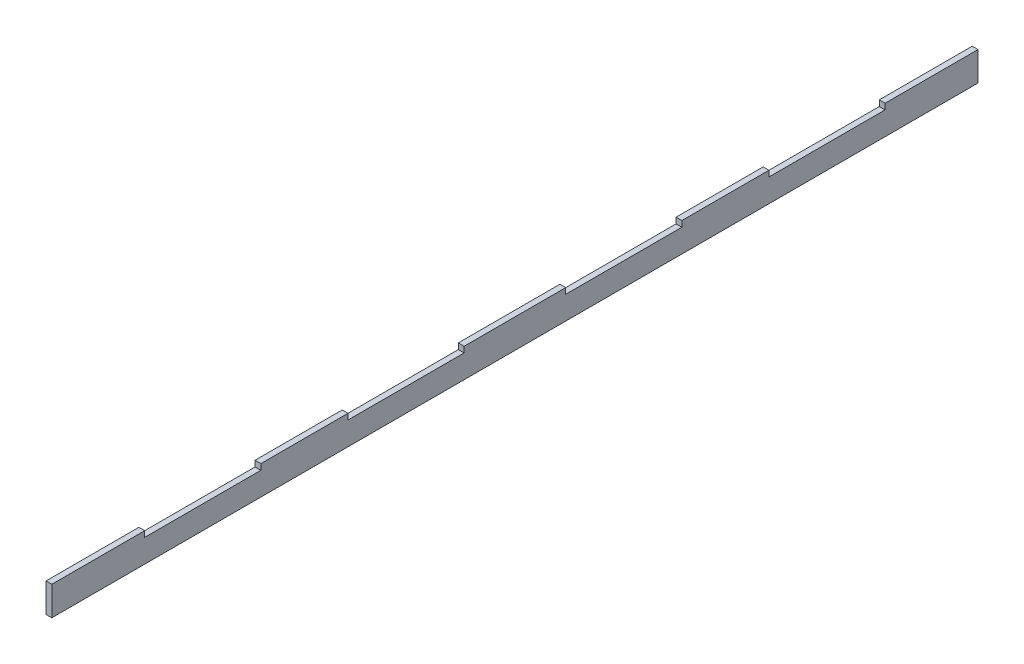
ISO-10303-21;
HEADER;
FILE_DESCRIPTION(('STEP AP214'),'2;1');
FILE_NAME('part.step','',(''),(''),'','','');
FILE_SCHEMA(('AUTOMOTIVE_DESIGN { 1 0 10303 214 1 1 1 1 }'));
ENDSEC;
DATA;
#1=APPLICATION_CONTEXT('core data for automotive mechanical design processes');
#2=APPLICATION_PROTOCOL_DEFINITION('international standard','automotive_design',2000,#1);
#3=PRODUCT_CONTEXT('',#1,'mechanical');
#4=PRODUCT('Part','Part','',(#3));
#5=PRODUCT_RELATED_PRODUCT_CATEGORY('part','',(#4));
#6=PRODUCT_DEFINITION_FORMATION('','',#4);
#7=PRODUCT_DEFINITION_CONTEXT('part definition',#1,'design');
#8=PRODUCT_DEFINITION('design','',#6,#7);
#9=PRODUCT_DEFINITION_SHAPE('','',#8);
#10=(LENGTH_UNIT() NAMED_UNIT(*) SI_UNIT(.MILLI.,.METRE.));
#11=(NAMED_UNIT(*) PLANE_ANGLE_UNIT() SI_UNIT($,.RADIAN.));
#12=(NAMED_UNIT(*) SI_UNIT($,.STERADIAN.) SOLID_ANGLE_UNIT());
#13=UNCERTAINTY_MEASURE_WITH_UNIT(LENGTH_MEASURE(1.E-05),#10,'distance_accuracy_value','');
#14=(GEOMETRIC_REPRESENTATION_CONTEXT(3) GLOBAL_UNCERTAINTY_ASSIGNED_CONTEXT((#13)) GLOBAL_UNIT_ASSIGNED_CONTEXT((#10,
#11,#12)) REPRESENTATION_CONTEXT('',''));
#15=CARTESIAN_POINT('',(0.,0.,0.));
#16=DIRECTION('',(0.,0.,1.));
#17=DIRECTION('',(1.,0.,0.));
#18=AXIS2_PLACEMENT_3D('',#15,#16,#17);
#19=CARTESIAN_POINT('',(2.,5.,159.5));
#20=DIRECTION('',(0.,-1.,0.));
#21=DIRECTION('',(0.,0.,-1.));
#22=AXIS2_PLACEMENT_3D('',#19,#20,#21);
#23=PLANE('',#22);
#24=DIRECTION('',(0.,0.,1.));
#25=VECTOR('',#24,1.);
#26=CARTESIAN_POINT('',(2.,5.,159.5));
#27=LINE('',#26,#25);
#28=CARTESIAN_POINT('',(2.,5.,127.5));
#29=VERTEX_POINT('',#28);
#30=CARTESIAN_POINT('',(2.,5.,159.5));
#31=VERTEX_POINT('',#30);
#32=EDGE_CURVE('E295',#29,#31,#27,.T.);
#33=ORIENTED_EDGE('',*,*,#32,.F.);
#34=DIRECTION('',(1.,0.,0.));
#35=VECTOR('',#34,1.);
#36=CARTESIAN_POINT('',(0.,5.,127.5));
#37=LINE('',#36,#35);
#38=CARTESIAN_POINT('',(0.,5.,127.5));
#39=VERTEX_POINT('',#38);
#40=EDGE_CURVE('E198',#39,#29,#37,.T.);
#41=ORIENTED_EDGE('',*,*,#40,.F.);
#42=DIRECTION('',(0.,0.,1.));
#43=VECTOR('',#42,1.);
#44=CARTESIAN_POINT('',(0.,5.,159.5));
#45=LINE('',#44,#43);
#46=CARTESIAN_POINT('',(0.,5.,159.5));
#47=VERTEX_POINT('',#46);
#48=EDGE_CURVE('E191',#39,#47,#45,.T.);
#49=ORIENTED_EDGE('',*,*,#48,.T.);
#50=DIRECTION('',(-1.,0.,0.));
#51=VECTOR('',#50,1.);
#52=CARTESIAN_POINT('',(2.,5.,159.5));
#53=LINE('',#52,#51);
#54=EDGE_CURVE('E41',#31,#47,#53,.T.);
#55=ORIENTED_EDGE('',*,*,#54,.F.);
#56=EDGE_LOOP('',(#33,#41,#49,#55));
#57=FACE_BOUND('',#56,.T.);
#58=ADVANCED_FACE('F33',(#57),#23,.F.);
#59=CARTESIAN_POINT('',(0.,5.,57.4999999999999));
#60=VERTEX_POINT('',#59);
#61=CARTESIAN_POINT('',(0.,5.,87.4999999999999));
#62=VERTEX_POINT('',#61);
#63=EDGE_CURVE('E375',#60,#62,#45,.T.);
#64=ORIENTED_EDGE('',*,*,#63,.T.);
#65=DIRECTION('',(1.,0.,0.));
#66=VECTOR('',#65,1.);
#67=CARTESIAN_POINT('',(0.,5.,87.4999999999999));
#68=LINE('',#67,#66);
#69=CARTESIAN_POINT('',(2.,5.,87.4999999999999));
#70=VERTEX_POINT('',#69);
#71=EDGE_CURVE('E201',#62,#70,#68,.T.);
#72=ORIENTED_EDGE('',*,*,#71,.T.);
#73=CARTESIAN_POINT('',(2.,5.,57.4999999999999));
#74=VERTEX_POINT('',#73);
#75=EDGE_CURVE('E338',#74,#70,#27,.T.);
#76=ORIENTED_EDGE('',*,*,#75,.F.);
#77=DIRECTION('',(1.,0.,0.));
#78=VECTOR('',#77,1.);
#79=CARTESIAN_POINT('',(0.,5.,57.4999999999999));
#80=LINE('',#79,#78);
#81=EDGE_CURVE('E192',#60,#74,#80,.T.);
#82=ORIENTED_EDGE('',*,*,#81,.F.);
#83=EDGE_LOOP('',(#64,#72,#76,#82));
#84=FACE_BOUND('',#83,.T.);
#85=ADVANCED_FACE('F374',(#84),#23,.F.);
#86=CARTESIAN_POINT('',(0.,5.,-87.4999999999999));
#87=VERTEX_POINT('',#86);
#88=CARTESIAN_POINT('',(0.,5.,-57.4999999999999));
#89=VERTEX_POINT('',#88);
#90=EDGE_CURVE('E312',#87,#89,#45,.T.);
#91=ORIENTED_EDGE('',*,*,#90,.T.);
#92=DIRECTION('',(1.,0.,0.));
#93=VECTOR('',#92,1.);
#94=CARTESIAN_POINT('',(0.,5.,-57.4999999999999));
#95=LINE('',#94,#93);
#96=CARTESIAN_POINT('',(2.,5.,-57.4999999999999));
#97=VERTEX_POINT('',#96);
#98=EDGE_CURVE('E209',#89,#97,#95,.T.);
#99=ORIENTED_EDGE('',*,*,#98,.T.);
#100=CARTESIAN_POINT('',(2.,5.,-87.4999999999999));
#101=VERTEX_POINT('',#100);
#102=EDGE_CURVE('E301',#101,#97,#27,.T.);
#103=ORIENTED_EDGE('',*,*,#102,.F.);
#104=DIRECTION('',(1.,0.,0.));
#105=VECTOR('',#104,1.);
#106=CARTESIAN_POINT('',(0.,5.,-87.4999999999999));
#107=LINE('',#106,#105);
#108=EDGE_CURVE('E249',#87,#101,#107,.T.);
#109=ORIENTED_EDGE('',*,*,#108,.F.);
#110=EDGE_LOOP('',(#91,#99,#103,#109));
#111=FACE_BOUND('',#110,.T.);
#112=ADVANCED_FACE('F349',(#111),#23,.F.);
#113=CARTESIAN_POINT('',(0.,5.,-159.5));
#114=VERTEX_POINT('',#113);
#115=CARTESIAN_POINT('',(0.,5.,-127.5));
#116=VERTEX_POINT('',#115);
#117=EDGE_CURVE('E308',#114,#116,#45,.T.);
#118=ORIENTED_EDGE('',*,*,#117,.T.);
#119=DIRECTION('',(1.,0.,0.));
#120=VECTOR('',#119,1.);
#121=CARTESIAN_POINT('',(0.,5.,-127.5));
#122=LINE('',#121,#120);
#123=CARTESIAN_POINT('',(2.,5.,-127.5));
#124=VERTEX_POINT('',#123);
#125=EDGE_CURVE('E224',#116,#124,#122,.T.);
#126=ORIENTED_EDGE('',*,*,#125,.T.);
#127=CARTESIAN_POINT('',(2.,5.,-159.5));
#128=VERTEX_POINT('',#127);
#129=EDGE_CURVE('E297',#128,#124,#27,.T.);
#130=ORIENTED_EDGE('',*,*,#129,.F.);
#131=DIRECTION('',(-1.,0.,0.));
#132=VECTOR('',#131,1.);
#133=CARTESIAN_POINT('',(2.,5.,-159.5));
#134=LINE('',#133,#132);
#135=EDGE_CURVE('E11',#128,#114,#134,.T.);
#136=ORIENTED_EDGE('',*,*,#135,.T.);
#137=EDGE_LOOP('',(#118,#126,#130,#136));
#138=FACE_BOUND('',#137,.T.);
#139=ADVANCED_FACE('F383',(#138),#23,.F.);
#140=CARTESIAN_POINT('',(2.,-5.,-159.5));
#141=DIRECTION('',(0.,0.,1.));
#142=DIRECTION('',(1.,0.,0.));
#143=AXIS2_PLACEMENT_3D('',#140,#141,#142);
#144=PLANE('',#143);
#145=DIRECTION('',(0.,1.,0.));
#146=VECTOR('',#145,1.);
#147=CARTESIAN_POINT('',(0.,-5.,-159.5));
#148=LINE('',#147,#146);
#149=CARTESIAN_POINT('',(0.,-5.,-159.5));
#150=VERTEX_POINT('',#149);
#151=EDGE_CURVE('E291',#150,#114,#148,.T.);
#152=ORIENTED_EDGE('',*,*,#151,.T.);
#153=ORIENTED_EDGE('',*,*,#135,.F.);
#154=DIRECTION('',(0.,1.,0.));
#155=VECTOR('',#154,1.);
#156=CARTESIAN_POINT('',(2.,-5.,-159.5));
#157=LINE('',#156,#155);
#158=CARTESIAN_POINT('',(2.,-5.,-159.5));
#159=VERTEX_POINT('',#158);
#160=EDGE_CURVE('E292',#159,#128,#157,.T.);
#161=ORIENTED_EDGE('',*,*,#160,.F.);
#162=DIRECTION('',(-1.,0.,0.));
#163=VECTOR('',#162,1.);
#164=CARTESIAN_POINT('',(2.,-5.,-159.5));
#165=LINE('',#164,#163);
#166=EDGE_CURVE('E305',#159,#150,#165,.T.);
#167=ORIENTED_EDGE('',*,*,#166,.T.);
#168=EDGE_LOOP('',(#152,#153,#161,#167));
#169=FACE_BOUND('',#168,.T.);
#170=ADVANCED_FACE('F35',(#169),#144,.F.);
#171=CARTESIAN_POINT('',(0.,5.,-17.4999999999999));
#172=VERTEX_POINT('',#171);
#173=CARTESIAN_POINT('',(0.,5.,17.4999999999999));
#174=VERTEX_POINT('',#173);
#175=EDGE_CURVE('E364',#172,#174,#45,.T.);
#176=ORIENTED_EDGE('',*,*,#175,.T.);
#177=DIRECTION('',(1.,0.,0.));
#178=VECTOR('',#177,1.);
#179=CARTESIAN_POINT('',(0.,5.,17.4999999999999));
#180=LINE('',#179,#178);
#181=CARTESIAN_POINT('',(2.,5.,17.4999999999999));
#182=VERTEX_POINT('',#181);
#183=EDGE_CURVE('E194',#174,#182,#180,.T.);
#184=ORIENTED_EDGE('',*,*,#183,.T.);
#185=CARTESIAN_POINT('',(2.,5.,-17.4999999999999));
#186=VERTEX_POINT('',#185);
#187=EDGE_CURVE('E340',#186,#182,#27,.T.);
#188=ORIENTED_EDGE('',*,*,#187,.F.);
#189=DIRECTION('',(1.,0.,0.));
#190=VECTOR('',#189,1.);
#191=CARTESIAN_POINT('',(0.,5.,-17.4999999999999));
#192=LINE('',#191,#190);
#193=EDGE_CURVE('E230',#172,#186,#192,.T.);
#194=ORIENTED_EDGE('',*,*,#193,.F.);
#195=EDGE_LOOP('',(#176,#184,#188,#194));
#196=FACE_BOUND('',#195,.T.);
#197=ADVANCED_FACE('F363',(#196),#23,.F.);
#198=CARTESIAN_POINT('',(2.,-5.,159.5));
#199=DIRECTION('',(0.,0.,-1.));
#200=DIRECTION('',(-1.,0.,0.));
#201=AXIS2_PLACEMENT_3D('',#198,#199,#200);
#202=PLANE('',#201);
#203=DIRECTION('',(0.,-1.,0.));
#204=VECTOR('',#203,1.);
#205=CARTESIAN_POINT('',(0.,-5.,159.5));
#206=LINE('',#205,#204);
#207=CARTESIAN_POINT('',(0.,-5.,159.5));
#208=VERTEX_POINT('',#207);
#209=EDGE_CURVE('E311',#47,#208,#206,.T.);
#210=ORIENTED_EDGE('',*,*,#209,.T.);
#211=DIRECTION('',(-1.,0.,0.));
#212=VECTOR('',#211,1.);
#213=CARTESIAN_POINT('',(2.,-5.,159.5));
#214=LINE('',#213,#212);
#215=CARTESIAN_POINT('',(2.,-5.,159.5));
#216=VERTEX_POINT('',#215);
#217=EDGE_CURVE('E317',#216,#208,#214,.T.);
#218=ORIENTED_EDGE('',*,*,#217,.F.);
#219=DIRECTION('',(0.,-1.,0.));
#220=VECTOR('',#219,1.);
#221=CARTESIAN_POINT('',(2.,-5.,159.5));
#222=LINE('',#221,#220);
#223=EDGE_CURVE('E300',#31,#216,#222,.T.);
#224=ORIENTED_EDGE('',*,*,#223,.F.);
#225=ORIENTED_EDGE('',*,*,#54,.T.);
#226=EDGE_LOOP('',(#210,#218,#224,#225));
#227=FACE_BOUND('',#226,.T.);
#228=ADVANCED_FACE('F323',(#227),#202,.F.);
#229=CARTESIAN_POINT('',(2.,-5.,159.5));
#230=DIRECTION('',(0.,1.,0.));
#231=DIRECTION('',(0.,0.,1.));
#232=AXIS2_PLACEMENT_3D('',#229,#230,#231);
#233=PLANE('',#232);
#234=DIRECTION('',(0.,0.,-1.));
#235=VECTOR('',#234,1.);
#236=CARTESIAN_POINT('',(0.,-5.,159.5));
#237=LINE('',#236,#235);
#238=EDGE_CURVE('E296',#208,#150,#237,.T.);
#239=ORIENTED_EDGE('',*,*,#238,.T.);
#240=ORIENTED_EDGE('',*,*,#166,.F.);
#241=DIRECTION('',(0.,0.,-1.));
#242=VECTOR('',#241,1.);
#243=CARTESIAN_POINT('',(2.,-5.,159.5));
#244=LINE('',#243,#242);
#245=EDGE_CURVE('E303',#216,#159,#244,.T.);
#246=ORIENTED_EDGE('',*,*,#245,.F.);
#247=ORIENTED_EDGE('',*,*,#217,.T.);
#248=EDGE_LOOP('',(#239,#240,#246,#247));
#249=FACE_BOUND('',#248,.T.);
#250=ADVANCED_FACE('F331',(#249),#233,.F.);
#251=CARTESIAN_POINT('',(2.,0.,0.));
#252=DIRECTION('',(-1.,0.,0.));
#253=DIRECTION('',(0.,0.,1.));
#254=AXIS2_PLACEMENT_3D('',#251,#252,#253);
#255=PLANE('',#254);
#256=DIRECTION('',(0.,0.,1.));
#257=VECTOR('',#256,1.);
#258=CARTESIAN_POINT('',(2.,3.,0.));
#259=LINE('',#258,#257);
#260=CARTESIAN_POINT('',(2.,3.,87.4999999999999));
#261=VERTEX_POINT('',#260);
#262=CARTESIAN_POINT('',(2.,3.,127.5));
#263=VERTEX_POINT('',#262);
#264=EDGE_CURVE('E285',#261,#263,#259,.T.);
#265=ORIENTED_EDGE('',*,*,#264,.T.);
#266=DIRECTION('',(0.,1.,0.));
#267=VECTOR('',#266,1.);
#268=CARTESIAN_POINT('',(2.,-3.53883589099268E-12,127.5));
#269=LINE('',#268,#267);
#270=EDGE_CURVE('E178',#263,#29,#269,.T.);
#271=ORIENTED_EDGE('',*,*,#270,.T.);
#272=ORIENTED_EDGE('',*,*,#32,.T.);
#273=ORIENTED_EDGE('',*,*,#223,.T.);
#274=ORIENTED_EDGE('',*,*,#245,.T.);
#275=ORIENTED_EDGE('',*,*,#160,.T.);
#276=ORIENTED_EDGE('',*,*,#129,.T.);
#277=DIRECTION('',(0.,-1.,0.));
#278=VECTOR('',#277,1.);
#279=CARTESIAN_POINT('',(2.,-3.53883589099268E-12,-127.5));
#280=LINE('',#279,#278);
#281=CARTESIAN_POINT('',(2.,3.,-127.5));
#282=VERTEX_POINT('',#281);
#283=EDGE_CURVE('E264',#124,#282,#280,.T.);
#284=ORIENTED_EDGE('',*,*,#283,.T.);
#285=DIRECTION('',(0.,0.,1.));
#286=VECTOR('',#285,1.);
#287=CARTESIAN_POINT('',(2.,3.,0.));
#288=LINE('',#287,#286);
#289=CARTESIAN_POINT('',(2.,3.,-87.4999999999999));
#290=VERTEX_POINT('',#289);
#291=EDGE_CURVE('E261',#282,#290,#288,.T.);
#292=ORIENTED_EDGE('',*,*,#291,.T.);
#293=DIRECTION('',(0.,1.,0.));
#294=VECTOR('',#293,1.);
#295=CARTESIAN_POINT('',(2.,0.,-87.4999999999999));
#296=LINE('',#295,#294);
#297=EDGE_CURVE('E200',#290,#101,#296,.T.);
#298=ORIENTED_EDGE('',*,*,#297,.T.);
#299=ORIENTED_EDGE('',*,*,#102,.T.);
#300=DIRECTION('',(0.,-1.,0.));
#301=VECTOR('',#300,1.);
#302=CARTESIAN_POINT('',(2.,0.,-57.4999999999999));
#303=LINE('',#302,#301);
#304=CARTESIAN_POINT('',(2.,3.,-57.4999999999999));
#305=VERTEX_POINT('',#304);
#306=EDGE_CURVE('E273',#97,#305,#303,.T.);
#307=ORIENTED_EDGE('',*,*,#306,.T.);
#308=DIRECTION('',(0.,0.,1.));
#309=VECTOR('',#308,1.);
#310=CARTESIAN_POINT('',(2.,3.,0.));
#311=LINE('',#310,#309);
#312=CARTESIAN_POINT('',(2.,3.,-17.4999999999999));
#313=VERTEX_POINT('',#312);
#314=EDGE_CURVE('E270',#305,#313,#311,.T.);
#315=ORIENTED_EDGE('',*,*,#314,.T.);
#316=DIRECTION('',(0.,1.,0.));
#317=VECTOR('',#316,1.);
#318=CARTESIAN_POINT('',(2.,0.,-17.4999999999999));
#319=LINE('',#318,#317);
#320=EDGE_CURVE('E267',#313,#186,#319,.T.);
#321=ORIENTED_EDGE('',*,*,#320,.T.);
#322=ORIENTED_EDGE('',*,*,#187,.T.);
#323=DIRECTION('',(0.,-1.,0.));
#324=VECTOR('',#323,1.);
#325=CARTESIAN_POINT('',(2.,0.,17.4999999999999));
#326=LINE('',#325,#324);
#327=CARTESIAN_POINT('',(2.,3.,17.4999999999999));
#328=VERTEX_POINT('',#327);
#329=EDGE_CURVE('E279',#182,#328,#326,.T.);
#330=ORIENTED_EDGE('',*,*,#329,.T.);
#331=DIRECTION('',(0.,0.,1.));
#332=VECTOR('',#331,1.);
#333=CARTESIAN_POINT('',(2.,3.,0.));
#334=LINE('',#333,#332);
#335=CARTESIAN_POINT('',(2.,3.,57.4999999999999));
#336=VERTEX_POINT('',#335);
#337=EDGE_CURVE('E276',#328,#336,#334,.T.);
#338=ORIENTED_EDGE('',*,*,#337,.T.);
#339=DIRECTION('',(0.,1.,0.));
#340=VECTOR('',#339,1.);
#341=CARTESIAN_POINT('',(2.,0.,57.4999999999999));
#342=LINE('',#341,#340);
#343=EDGE_CURVE('E282',#336,#74,#342,.T.);
#344=ORIENTED_EDGE('',*,*,#343,.T.);
#345=ORIENTED_EDGE('',*,*,#75,.T.);
#346=DIRECTION('',(0.,-1.,0.));
#347=VECTOR('',#346,1.);
#348=CARTESIAN_POINT('',(2.,0.,87.4999999999999));
#349=LINE('',#348,#347);
#350=EDGE_CURVE('E287',#70,#261,#349,.T.);
#351=ORIENTED_EDGE('',*,*,#350,.T.);
#352=EDGE_LOOP('',(#265,#271,#272,#273,#274,#275,#276,#284,#292,#298,#299,#307,#315,#321,#322,
#330,#338,#344,#345,#351));
#353=FACE_BOUND('',#352,.T.);
#354=ADVANCED_FACE('F337',(#353),#255,.F.);
#355=CARTESIAN_POINT('',(0.,0.,0.));
#356=DIRECTION('',(-1.,0.,0.));
#357=DIRECTION('',(0.,0.,1.));
#358=AXIS2_PLACEMENT_3D('',#355,#356,#357);
#359=PLANE('',#358);
#360=DIRECTION('',(0.,-1.,0.));
#361=VECTOR('',#360,1.);
#362=CARTESIAN_POINT('',(0.,5.,127.5));
#363=LINE('',#362,#361);
#364=CARTESIAN_POINT('',(0.,3.,127.5));
#365=VERTEX_POINT('',#364);
#366=EDGE_CURVE('E175',#39,#365,#363,.T.);
#367=ORIENTED_EDGE('',*,*,#366,.T.);
#368=DIRECTION('',(0.,0.,-1.));
#369=VECTOR('',#368,1.);
#370=CARTESIAN_POINT('',(0.,3.,127.5));
#371=LINE('',#370,#369);
#372=CARTESIAN_POINT('',(0.,3.,87.4999999999999));
#373=VERTEX_POINT('',#372);
#374=EDGE_CURVE('E184',#365,#373,#371,.T.);
#375=ORIENTED_EDGE('',*,*,#374,.T.);
#376=DIRECTION('',(0.,1.,0.));
#377=VECTOR('',#376,1.);
#378=CARTESIAN_POINT('',(0.,5.,87.4999999999999));
#379=LINE('',#378,#377);
#380=EDGE_CURVE('E48',#373,#62,#379,.T.);
#381=ORIENTED_EDGE('',*,*,#380,.T.);
#382=ORIENTED_EDGE('',*,*,#63,.F.);
#383=DIRECTION('',(0.,-1.,0.));
#384=VECTOR('',#383,1.);
#385=CARTESIAN_POINT('',(0.,5.,57.4999999999999));
#386=LINE('',#385,#384);
#387=CARTESIAN_POINT('',(0.,3.,57.4999999999999));
#388=VERTEX_POINT('',#387);
#389=EDGE_CURVE('E205',#60,#388,#386,.T.);
#390=ORIENTED_EDGE('',*,*,#389,.T.);
#391=DIRECTION('',(0.,0.,-1.));
#392=VECTOR('',#391,1.);
#393=CARTESIAN_POINT('',(0.,3.,57.4999999999999));
#394=LINE('',#393,#392);
#395=CARTESIAN_POINT('',(0.,3.,17.4999999999999));
#396=VERTEX_POINT('',#395);
#397=EDGE_CURVE('E208',#388,#396,#394,.T.);
#398=ORIENTED_EDGE('',*,*,#397,.T.);
#399=DIRECTION('',(0.,1.,0.));
#400=VECTOR('',#399,1.);
#401=CARTESIAN_POINT('',(0.,5.,17.4999999999999));
#402=LINE('',#401,#400);
#403=EDGE_CURVE('E56',#396,#174,#402,.T.);
#404=ORIENTED_EDGE('',*,*,#403,.T.);
#405=ORIENTED_EDGE('',*,*,#175,.F.);
#406=DIRECTION('',(0.,-1.,0.));
#407=VECTOR('',#406,1.);
#408=CARTESIAN_POINT('',(0.,5.,-17.4999999999999));
#409=LINE('',#408,#407);
#410=CARTESIAN_POINT('',(0.,3.,-17.4999999999999));
#411=VERTEX_POINT('',#410);
#412=EDGE_CURVE('E220',#172,#411,#409,.T.);
#413=ORIENTED_EDGE('',*,*,#412,.T.);
#414=DIRECTION('',(0.,0.,-1.));
#415=VECTOR('',#414,1.);
#416=CARTESIAN_POINT('',(0.,3.,-57.4999999999999));
#417=LINE('',#416,#415);
#418=CARTESIAN_POINT('',(0.,3.,-57.4999999999999));
#419=VERTEX_POINT('',#418);
#420=EDGE_CURVE('E223',#411,#419,#417,.T.);
#421=ORIENTED_EDGE('',*,*,#420,.T.);
#422=DIRECTION('',(0.,1.,0.));
#423=VECTOR('',#422,1.);
#424=CARTESIAN_POINT('',(0.,5.,-57.4999999999999));
#425=LINE('',#424,#423);
#426=EDGE_CURVE('E227',#419,#89,#425,.T.);
#427=ORIENTED_EDGE('',*,*,#426,.T.);
#428=ORIENTED_EDGE('',*,*,#90,.F.);
#429=DIRECTION('',(0.,-1.,0.));
#430=VECTOR('',#429,1.);
#431=CARTESIAN_POINT('',(0.,5.,-87.4999999999999));
#432=LINE('',#431,#430);
#433=CARTESIAN_POINT('',(0.,3.,-87.4999999999999));
#434=VERTEX_POINT('',#433);
#435=EDGE_CURVE('E240',#87,#434,#432,.T.);
#436=ORIENTED_EDGE('',*,*,#435,.T.);
#437=DIRECTION('',(0.,0.,-1.));
#438=VECTOR('',#437,1.);
#439=CARTESIAN_POINT('',(0.,3.,-127.5));
#440=LINE('',#439,#438);
#441=CARTESIAN_POINT('',(0.,3.,-127.5));
#442=VERTEX_POINT('',#441);
#443=EDGE_CURVE('E243',#434,#442,#440,.T.);
#444=ORIENTED_EDGE('',*,*,#443,.T.);
#445=DIRECTION('',(0.,1.,0.));
#446=VECTOR('',#445,1.);
#447=CARTESIAN_POINT('',(0.,5.,-127.5));
#448=LINE('',#447,#446);
#449=EDGE_CURVE('E246',#442,#116,#448,.T.);
#450=ORIENTED_EDGE('',*,*,#449,.T.);
#451=ORIENTED_EDGE('',*,*,#117,.F.);
#452=ORIENTED_EDGE('',*,*,#151,.F.);
#453=ORIENTED_EDGE('',*,*,#238,.F.);
#454=ORIENTED_EDGE('',*,*,#209,.F.);
#455=ORIENTED_EDGE('',*,*,#48,.F.);
#456=EDGE_LOOP('',(#367,#375,#381,#382,#390,#398,#404,#405,#413,#421,#427,#428,#436,#444,#450,
#451,#452,#453,#454,#455));
#457=FACE_BOUND('',#456,.T.);
#458=ADVANCED_FACE('F189',(#457),#359,.T.);
#459=CARTESIAN_POINT('',(0.,5.,-127.5));
#460=DIRECTION('',(0.,0.,-1.));
#461=DIRECTION('',(0.,1.,0.));
#462=AXIS2_PLACEMENT_3D('',#459,#460,#461);
#463=PLANE('',#462);
#464=ORIENTED_EDGE('',*,*,#125,.F.);
#465=ORIENTED_EDGE('',*,*,#449,.F.);
#466=DIRECTION('',(1.,0.,0.));
#467=VECTOR('',#466,1.);
#468=CARTESIAN_POINT('',(0.,3.,-127.5));
#469=LINE('',#468,#467);
#470=EDGE_CURVE('E252',#442,#282,#469,.T.);
#471=ORIENTED_EDGE('',*,*,#470,.T.);
#472=ORIENTED_EDGE('',*,*,#283,.F.);
#473=EDGE_LOOP('',(#464,#465,#471,#472));
#474=FACE_BOUND('',#473,.T.);
#475=ADVANCED_FACE('F395',(#474),#463,.F.);
#476=CARTESIAN_POINT('',(0.,3.,-127.5));
#477=DIRECTION('',(0.,-1.,0.));
#478=DIRECTION('',(0.,0.,-1.));
#479=AXIS2_PLACEMENT_3D('',#476,#477,#478);
#480=PLANE('',#479);
#481=ORIENTED_EDGE('',*,*,#470,.F.);
#482=ORIENTED_EDGE('',*,*,#443,.F.);
#483=DIRECTION('',(1.,0.,0.));
#484=VECTOR('',#483,1.);
#485=CARTESIAN_POINT('',(0.,3.,-87.4999999999999));
#486=LINE('',#485,#484);
#487=EDGE_CURVE('E255',#434,#290,#486,.T.);
#488=ORIENTED_EDGE('',*,*,#487,.T.);
#489=ORIENTED_EDGE('',*,*,#291,.F.);
#490=EDGE_LOOP('',(#481,#482,#488,#489));
#491=FACE_BOUND('',#490,.T.);
#492=ADVANCED_FACE('F397',(#491),#480,.F.);
#493=CARTESIAN_POINT('',(0.,5.,-87.4999999999999));
#494=DIRECTION('',(0.,0.,1.));
#495=DIRECTION('',(1.,0.,0.));
#496=AXIS2_PLACEMENT_3D('',#493,#494,#495);
#497=PLANE('',#496);
#498=ORIENTED_EDGE('',*,*,#487,.F.);
#499=ORIENTED_EDGE('',*,*,#435,.F.);
#500=ORIENTED_EDGE('',*,*,#108,.T.);
#501=ORIENTED_EDGE('',*,*,#297,.F.);
#502=EDGE_LOOP('',(#498,#499,#500,#501));
#503=FACE_BOUND('',#502,.T.);
#504=ADVANCED_FACE('F400',(#503),#497,.F.);
#505=CARTESIAN_POINT('',(0.,5.,-57.4999999999999));
#506=DIRECTION('',(0.,0.,-1.));
#507=DIRECTION('',(-1.,0.,0.));
#508=AXIS2_PLACEMENT_3D('',#505,#506,#507);
#509=PLANE('',#508);
#510=ORIENTED_EDGE('',*,*,#98,.F.);
#511=ORIENTED_EDGE('',*,*,#426,.F.);
#512=DIRECTION('',(1.,0.,0.));
#513=VECTOR('',#512,1.);
#514=CARTESIAN_POINT('',(0.,3.,-57.4999999999999));
#515=LINE('',#514,#513);
#516=EDGE_CURVE('E233',#419,#305,#515,.T.);
#517=ORIENTED_EDGE('',*,*,#516,.T.);
#518=ORIENTED_EDGE('',*,*,#306,.F.);
#519=EDGE_LOOP('',(#510,#511,#517,#518));
#520=FACE_BOUND('',#519,.T.);
#521=ADVANCED_FACE('F353',(#520),#509,.F.);
#522=CARTESIAN_POINT('',(0.,3.,-57.4999999999999));
#523=DIRECTION('',(0.,-1.,0.));
#524=DIRECTION('',(0.,0.,-1.));
#525=AXIS2_PLACEMENT_3D('',#522,#523,#524);
#526=PLANE('',#525);
#527=ORIENTED_EDGE('',*,*,#516,.F.);
#528=ORIENTED_EDGE('',*,*,#420,.F.);
#529=DIRECTION('',(1.,0.,0.));
#530=VECTOR('',#529,1.);
#531=CARTESIAN_POINT('',(0.,3.,-17.4999999999999));
#532=LINE('',#531,#530);
#533=EDGE_CURVE('E236',#411,#313,#532,.T.);
#534=ORIENTED_EDGE('',*,*,#533,.T.);
#535=ORIENTED_EDGE('',*,*,#314,.F.);
#536=EDGE_LOOP('',(#527,#528,#534,#535));
#537=FACE_BOUND('',#536,.T.);
#538=ADVANCED_FACE('F357',(#537),#526,.F.);
#539=CARTESIAN_POINT('',(0.,5.,-17.4999999999999));
#540=DIRECTION('',(0.,0.,1.));
#541=DIRECTION('',(1.,0.,0.));
#542=AXIS2_PLACEMENT_3D('',#539,#540,#541);
#543=PLANE('',#542);
#544=ORIENTED_EDGE('',*,*,#533,.F.);
#545=ORIENTED_EDGE('',*,*,#412,.F.);
#546=ORIENTED_EDGE('',*,*,#193,.T.);
#547=ORIENTED_EDGE('',*,*,#320,.F.);
#548=EDGE_LOOP('',(#544,#545,#546,#547));
#549=FACE_BOUND('',#548,.T.);
#550=ADVANCED_FACE('F359',(#549),#543,.F.);
#551=CARTESIAN_POINT('',(0.,5.,57.4999999999999));
#552=DIRECTION('',(0.,0.,1.));
#553=DIRECTION('',(1.,0.,0.));
#554=AXIS2_PLACEMENT_3D('',#551,#552,#553);
#555=PLANE('',#554);
#556=DIRECTION('',(1.,0.,0.));
#557=VECTOR('',#556,1.);
#558=CARTESIAN_POINT('',(0.,3.,57.4999999999999));
#559=LINE('',#558,#557);
#560=EDGE_CURVE('E212',#388,#336,#559,.T.);
#561=ORIENTED_EDGE('',*,*,#560,.F.);
#562=ORIENTED_EDGE('',*,*,#389,.F.);
#563=ORIENTED_EDGE('',*,*,#81,.T.);
#564=ORIENTED_EDGE('',*,*,#343,.F.);
#565=EDGE_LOOP('',(#561,#562,#563,#564));
#566=FACE_BOUND('',#565,.T.);
#567=ADVANCED_FACE('F464',(#566),#555,.F.);
#568=CARTESIAN_POINT('',(0.,5.,17.4999999999999));
#569=DIRECTION('',(0.,0.,-1.));
#570=DIRECTION('',(-1.,0.,0.));
#571=AXIS2_PLACEMENT_3D('',#568,#569,#570);
#572=PLANE('',#571);
#573=ORIENTED_EDGE('',*,*,#183,.F.);
#574=ORIENTED_EDGE('',*,*,#403,.F.);
#575=DIRECTION('',(1.,0.,0.));
#576=VECTOR('',#575,1.);
#577=CARTESIAN_POINT('',(0.,3.,17.4999999999999));
#578=LINE('',#577,#576);
#579=EDGE_CURVE('E216',#396,#328,#578,.T.);
#580=ORIENTED_EDGE('',*,*,#579,.T.);
#581=ORIENTED_EDGE('',*,*,#329,.F.);
#582=EDGE_LOOP('',(#573,#574,#580,#581));
#583=FACE_BOUND('',#582,.T.);
#584=ADVANCED_FACE('F365',(#583),#572,.F.);
#585=CARTESIAN_POINT('',(0.,3.,57.4999999999999));
#586=DIRECTION('',(0.,-1.,0.));
#587=DIRECTION('',(0.,0.,-1.));
#588=AXIS2_PLACEMENT_3D('',#585,#586,#587);
#589=PLANE('',#588);
#590=ORIENTED_EDGE('',*,*,#579,.F.);
#591=ORIENTED_EDGE('',*,*,#397,.F.);
#592=ORIENTED_EDGE('',*,*,#560,.T.);
#593=ORIENTED_EDGE('',*,*,#337,.F.);
#594=EDGE_LOOP('',(#590,#591,#592,#593));
#595=FACE_BOUND('',#594,.T.);
#596=ADVANCED_FACE('F369',(#595),#589,.F.);
#597=CARTESIAN_POINT('',(0.,5.,127.5));
#598=DIRECTION('',(0.,0.,1.));
#599=DIRECTION('',(0.,-1.,0.));
#600=AXIS2_PLACEMENT_3D('',#597,#598,#599);
#601=PLANE('',#600);
#602=DIRECTION('',(1.,0.,0.));
#603=VECTOR('',#602,1.);
#604=CARTESIAN_POINT('',(0.,3.,127.5));
#605=LINE('',#604,#603);
#606=EDGE_CURVE('E171',#365,#263,#605,.T.);
#607=ORIENTED_EDGE('',*,*,#606,.F.);
#608=ORIENTED_EDGE('',*,*,#366,.F.);
#609=ORIENTED_EDGE('',*,*,#40,.T.);
#610=ORIENTED_EDGE('',*,*,#270,.F.);
#611=EDGE_LOOP('',(#607,#608,#609,#610));
#612=FACE_BOUND('',#611,.T.);
#613=ADVANCED_FACE('F173',(#612),#601,.F.);
#614=CARTESIAN_POINT('',(0.,5.,87.4999999999999));
#615=DIRECTION('',(0.,0.,-1.));
#616=DIRECTION('',(-1.,0.,0.));
#617=AXIS2_PLACEMENT_3D('',#614,#615,#616);
#618=PLANE('',#617);
#619=ORIENTED_EDGE('',*,*,#71,.F.);
#620=ORIENTED_EDGE('',*,*,#380,.F.);
#621=DIRECTION('',(1.,0.,0.));
#622=VECTOR('',#621,1.);
#623=CARTESIAN_POINT('',(0.,3.,87.4999999999999));
#624=LINE('',#623,#622);
#625=EDGE_CURVE('E181',#373,#261,#624,.T.);
#626=ORIENTED_EDGE('',*,*,#625,.T.);
#627=ORIENTED_EDGE('',*,*,#350,.F.);
#628=EDGE_LOOP('',(#619,#620,#626,#627));
#629=FACE_BOUND('',#628,.T.);
#630=ADVANCED_FACE('F376',(#629),#618,.F.);
#631=CARTESIAN_POINT('',(0.,3.,127.5));
#632=DIRECTION('',(0.,-1.,0.));
#633=DIRECTION('',(0.,0.,-1.));
#634=AXIS2_PLACEMENT_3D('',#631,#632,#633);
#635=PLANE('',#634);
#636=ORIENTED_EDGE('',*,*,#625,.F.);
#637=ORIENTED_EDGE('',*,*,#374,.F.);
#638=ORIENTED_EDGE('',*,*,#606,.T.);
#639=ORIENTED_EDGE('',*,*,#264,.F.);
#640=EDGE_LOOP('',(#636,#637,#638,#639));
#641=FACE_BOUND('',#640,.T.);
#642=ADVANCED_FACE('F185',(#641),#635,.F.);
#643=CLOSED_SHELL('',(#58,#85,#112,#139,#170,#197,#228,#250,#354,#458,#475,#492,#504,#521,#538,
#550,#567,#584,#596,#613,#630,#642));
#644=MANIFOLD_SOLID_BREP('B2',#643);
#645=ADVANCED_BREP_SHAPE_REPRESENTATION('',(#18,#644),#14);
#646=SHAPE_DEFINITION_REPRESENTATION(#9,#645);
ENDSEC;
END-ISO-10303-21;
